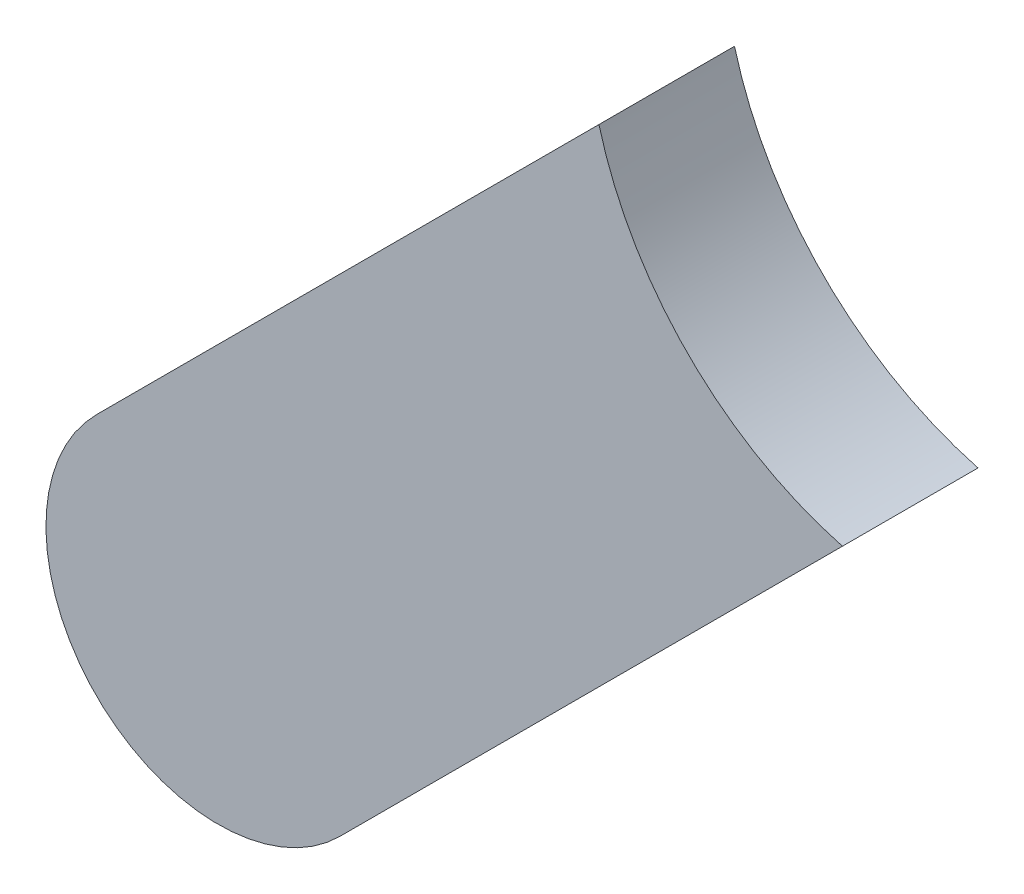
ISO-10303-21;
HEADER;
FILE_DESCRIPTION(('STEP AP214'),'2;1');
FILE_NAME('part.step','',(''),(''),'','','');
FILE_SCHEMA(('AUTOMOTIVE_DESIGN { 1 0 10303 214 1 1 1 1 }'));
ENDSEC;
DATA;
#1=APPLICATION_CONTEXT('core data for automotive mechanical design processes');
#2=APPLICATION_PROTOCOL_DEFINITION('international standard','automotive_design',2000,#1);
#3=PRODUCT_CONTEXT('',#1,'mechanical');
#4=PRODUCT('Part','Part','',(#3));
#5=PRODUCT_RELATED_PRODUCT_CATEGORY('part','',(#4));
#6=PRODUCT_DEFINITION_FORMATION('','',#4);
#7=PRODUCT_DEFINITION_CONTEXT('part definition',#1,'design');
#8=PRODUCT_DEFINITION('design','',#6,#7);
#9=PRODUCT_DEFINITION_SHAPE('','',#8);
#10=(LENGTH_UNIT() NAMED_UNIT(*) SI_UNIT(.MILLI.,.METRE.));
#11=(NAMED_UNIT(*) PLANE_ANGLE_UNIT() SI_UNIT($,.RADIAN.));
#12=(NAMED_UNIT(*) SI_UNIT($,.STERADIAN.) SOLID_ANGLE_UNIT());
#13=UNCERTAINTY_MEASURE_WITH_UNIT(LENGTH_MEASURE(1.E-05),#10,'distance_accuracy_value','');
#14=(GEOMETRIC_REPRESENTATION_CONTEXT(3) GLOBAL_UNCERTAINTY_ASSIGNED_CONTEXT((#13)) GLOBAL_UNIT_ASSIGNED_CONTEXT((#10,
#11,#12)) REPRESENTATION_CONTEXT('',''));
#15=CARTESIAN_POINT('',(0.,0.,0.));
#16=DIRECTION('',(0.,0.,1.));
#17=DIRECTION('',(1.,0.,0.));
#18=AXIS2_PLACEMENT_3D('',#15,#16,#17);
#19=CARTESIAN_POINT('',(151.90808074,56.46239406,0.));
#20=DIRECTION('',(-0.70710678118655,0.707106781186545,0.));
#21=DIRECTION('',(0.707106781186545,0.70710678118655,0.));
#22=AXIS2_PLACEMENT_3D('',#19,#20,#21);
#23=PLANE('',#22);
#24=DIRECTION('',(0.707106781186545,0.70710678118655,0.));
#25=VECTOR('',#24,1.);
#26=CARTESIAN_POINT('',(151.90808074,56.46239406,0.1999996));
#27=LINE('',#26,#25);
#28=CARTESIAN_POINT('',(151.90808074,56.46239406,0.1999996));
#29=VERTEX_POINT('',#28);
#30=CARTESIAN_POINT('',(152.649521214697,57.2038345346972,0.1999996));
#31=VERTEX_POINT('',#30);
#32=EDGE_CURVE('E11',#29,#31,#27,.T.);
#33=ORIENTED_EDGE('',*,*,#32,.F.);
#34=DIRECTION('',(0.,0.,1.));
#35=VECTOR('',#34,1.);
#36=CARTESIAN_POINT('',(151.90808074,56.46239406,0.));
#37=LINE('',#36,#35);
#38=CARTESIAN_POINT('',(151.90808074,56.46239406,0.));
#39=VERTEX_POINT('',#38);
#40=EDGE_CURVE('E24',#39,#29,#37,.T.);
#41=ORIENTED_EDGE('',*,*,#40,.F.);
#42=DIRECTION('',(0.707106781186545,0.70710678118655,0.));
#43=VECTOR('',#42,1.);
#44=CARTESIAN_POINT('',(151.90808074,56.46239406,0.));
#45=LINE('',#44,#43);
#46=CARTESIAN_POINT('',(152.649521214697,57.2038345346972,0.));
#47=VERTEX_POINT('',#46);
#48=EDGE_CURVE('E75',#39,#47,#45,.T.);
#49=ORIENTED_EDGE('',*,*,#48,.T.);
#50=DIRECTION('',(0.,0.,1.));
#51=VECTOR('',#50,1.);
#52=CARTESIAN_POINT('',(152.649521214697,57.2038345346972,0.));
#53=LINE('',#52,#51);
#54=EDGE_CURVE('E37',#47,#31,#53,.T.);
#55=ORIENTED_EDGE('',*,*,#54,.T.);
#56=EDGE_LOOP('',(#33,#41,#49,#55));
#57=FACE_BOUND('',#56,.T.);
#58=ADVANCED_FACE('F17',(#57),#23,.F.);
#59=CARTESIAN_POINT('',(152.781,57.6945252,0.));
#60=DIRECTION('',(0.,0.,-1.));
#61=DIRECTION('',(1.,0.,0.));
#62=AXIS2_PLACEMENT_3D('',#59,#60,#61);
#63=CYLINDRICAL_SURFACE('',#62,0.508);
#64=DIRECTION('',(0.,0.,1.));
#65=VECTOR('',#64,1.);
#66=CARTESIAN_POINT('',(152.290309334697,57.5630464146972,0.));
#67=LINE('',#66,#65);
#68=CARTESIAN_POINT('',(152.290309334697,57.5630464146972,0.));
#69=VERTEX_POINT('',#68);
#70=CARTESIAN_POINT('',(152.290309334697,57.5630464146972,0.1999996));
#71=VERTEX_POINT('',#70);
#72=EDGE_CURVE('E67',#69,#71,#67,.T.);
#73=ORIENTED_EDGE('',*,*,#72,.T.);
#74=CARTESIAN_POINT('',(152.781,57.6945252,0.1999996));
#75=DIRECTION('',(0.,0.,1.));
#76=DIRECTION('',(1.,0.,0.));
#77=AXIS2_PLACEMENT_3D('',#74,#75,#76);
#78=CIRCLE('',#77,0.508);
#79=EDGE_CURVE('E82',#71,#31,#78,.T.);
#80=ORIENTED_EDGE('',*,*,#79,.T.);
#81=ORIENTED_EDGE('',*,*,#54,.F.);
#82=CARTESIAN_POINT('',(152.781,57.6945252,0.));
#83=DIRECTION('',(0.,0.,1.));
#84=DIRECTION('',(1.,0.,0.));
#85=AXIS2_PLACEMENT_3D('',#82,#83,#84);
#86=CIRCLE('',#85,0.508);
#87=EDGE_CURVE('E80',#69,#47,#86,.T.);
#88=ORIENTED_EDGE('',*,*,#87,.F.);
#89=EDGE_LOOP('',(#73,#80,#81,#88));
#90=FACE_BOUND('',#89,.T.);
#91=ADVANCED_FACE('F88',(#90),#63,.F.);
#92=CARTESIAN_POINT('',(152.290309334697,57.5630464146972,0.));
#93=DIRECTION('',(0.70710678118655,-0.707106781186545,0.));
#94=DIRECTION('',(-0.707106781186545,-0.70710678118655,0.));
#95=AXIS2_PLACEMENT_3D('',#92,#93,#94);
#96=PLANE('',#95);
#97=DIRECTION('',(-0.707106781186545,-0.70710678118655,0.));
#98=VECTOR('',#97,1.);
#99=CARTESIAN_POINT('',(152.60139406,57.87413114,0.1999996));
#100=LINE('',#99,#98);
#101=CARTESIAN_POINT('',(151.54886886,56.82160594,0.1999996));
#102=VERTEX_POINT('',#101);
#103=EDGE_CURVE('E71',#71,#102,#100,.T.);
#104=ORIENTED_EDGE('',*,*,#103,.F.);
#105=ORIENTED_EDGE('',*,*,#72,.F.);
#106=DIRECTION('',(-0.707106781186545,-0.70710678118655,0.));
#107=VECTOR('',#106,1.);
#108=CARTESIAN_POINT('',(152.60139406,57.87413114,0.));
#109=LINE('',#108,#107);
#110=CARTESIAN_POINT('',(151.54886886,56.82160594,0.));
#111=VERTEX_POINT('',#110);
#112=EDGE_CURVE('E63',#69,#111,#109,.T.);
#113=ORIENTED_EDGE('',*,*,#112,.T.);
#114=DIRECTION('',(0.,0.,1.));
#115=VECTOR('',#114,1.);
#116=CARTESIAN_POINT('',(151.54886886,56.82160594,0.));
#117=LINE('',#116,#115);
#118=EDGE_CURVE('E53',#111,#102,#117,.T.);
#119=ORIENTED_EDGE('',*,*,#118,.T.);
#120=EDGE_LOOP('',(#104,#105,#113,#119));
#121=FACE_BOUND('',#120,.T.);
#122=ADVANCED_FACE('F66',(#121),#96,.F.);
#123=CARTESIAN_POINT('',(151.7284748,56.642,0.));
#124=DIRECTION('',(0.,0.,-1.));
#125=DIRECTION('',(-0.707106781186562,0.707106781186534,0.));
#126=AXIS2_PLACEMENT_3D('',#123,#124,#125);
#127=CYLINDRICAL_SURFACE('',#126,0.254001156230776);
#128=CARTESIAN_POINT('',(151.7284748,56.642,0.1999996));
#129=DIRECTION('',(0.,0.,1.));
#130=DIRECTION('',(-0.707106781186562,0.707106781186534,0.));
#131=AXIS2_PLACEMENT_3D('',#128,#129,#130);
#132=CIRCLE('',#131,0.254001156230776);
#133=EDGE_CURVE('E59',#102,#29,#132,.T.);
#134=ORIENTED_EDGE('',*,*,#133,.F.);
#135=ORIENTED_EDGE('',*,*,#118,.F.);
#136=CARTESIAN_POINT('',(151.7284748,56.642,0.));
#137=DIRECTION('',(0.,0.,1.));
#138=DIRECTION('',(-0.707106781186562,0.707106781186534,0.));
#139=AXIS2_PLACEMENT_3D('',#136,#137,#138);
#140=CIRCLE('',#139,0.254001156230776);
#141=EDGE_CURVE('E57',#111,#39,#140,.T.);
#142=ORIENTED_EDGE('',*,*,#141,.T.);
#143=ORIENTED_EDGE('',*,*,#40,.T.);
#144=EDGE_LOOP('',(#134,#135,#142,#143));
#145=FACE_BOUND('',#144,.T.);
#146=ADVANCED_FACE('F55',(#145),#127,.T.);
#147=CARTESIAN_POINT('',(151.90808074,56.46239406,0.));
#148=DIRECTION('',(0.,0.,-1.));
#149=DIRECTION('',(-1.,0.,0.));
#150=AXIS2_PLACEMENT_3D('',#147,#148,#149);
#151=PLANE('',#150);
#152=ORIENTED_EDGE('',*,*,#48,.F.);
#153=ORIENTED_EDGE('',*,*,#141,.F.);
#154=ORIENTED_EDGE('',*,*,#112,.F.);
#155=ORIENTED_EDGE('',*,*,#87,.T.);
#156=EDGE_LOOP('',(#152,#153,#154,#155));
#157=FACE_BOUND('',#156,.T.);
#158=ADVANCED_FACE('F74',(#157),#151,.T.);
#159=CARTESIAN_POINT('',(151.90808074,56.46239406,0.1999996));
#160=DIRECTION('',(0.,0.,-1.));
#161=DIRECTION('',(-1.,0.,0.));
#162=AXIS2_PLACEMENT_3D('',#159,#160,#161);
#163=PLANE('',#162);
#164=ORIENTED_EDGE('',*,*,#133,.T.);
#165=ORIENTED_EDGE('',*,*,#32,.T.);
#166=ORIENTED_EDGE('',*,*,#79,.F.);
#167=ORIENTED_EDGE('',*,*,#103,.T.);
#168=EDGE_LOOP('',(#164,#165,#166,#167));
#169=FACE_BOUND('',#168,.T.);
#170=ADVANCED_FACE('F91',(#169),#163,.F.);
#171=CLOSED_SHELL('',(#58,#91,#122,#146,#158,#170));
#172=MANIFOLD_SOLID_BREP('B1',#171);
#173=ADVANCED_BREP_SHAPE_REPRESENTATION('',(#18,#172),#14);
#174=SHAPE_DEFINITION_REPRESENTATION(#9,#173);
ENDSEC;
END-ISO-10303-21;
